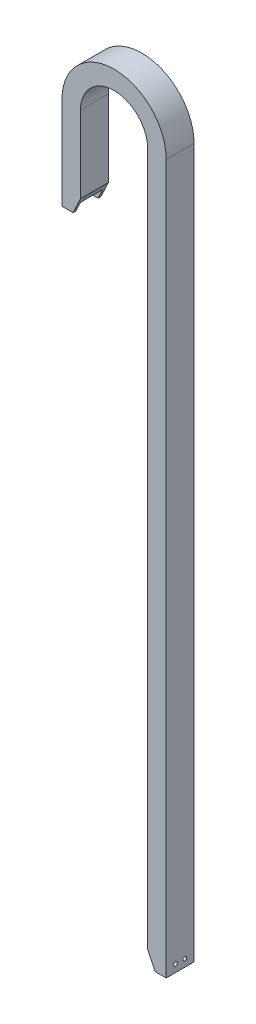
ISO-10303-21;
HEADER;
FILE_DESCRIPTION(('STEP AP214'),'2;1');
FILE_NAME('part.step','',(''),(''),'','','');
FILE_SCHEMA(('AUTOMOTIVE_DESIGN { 1 0 10303 214 1 1 1 1 }'));
ENDSEC;
DATA;
#1=APPLICATION_CONTEXT('core data for automotive mechanical design processes');
#2=APPLICATION_PROTOCOL_DEFINITION('international standard','automotive_design',2000,#1);
#3=PRODUCT_CONTEXT('',#1,'mechanical');
#4=PRODUCT('Part','Part','',(#3));
#5=PRODUCT_RELATED_PRODUCT_CATEGORY('part','',(#4));
#6=PRODUCT_DEFINITION_FORMATION('','',#4);
#7=PRODUCT_DEFINITION_CONTEXT('part definition',#1,'design');
#8=PRODUCT_DEFINITION('design','',#6,#7);
#9=PRODUCT_DEFINITION_SHAPE('','',#8);
#10=(LENGTH_UNIT() NAMED_UNIT(*) SI_UNIT(.MILLI.,.METRE.));
#11=(NAMED_UNIT(*) PLANE_ANGLE_UNIT() SI_UNIT($,.RADIAN.));
#12=(NAMED_UNIT(*) SI_UNIT($,.STERADIAN.) SOLID_ANGLE_UNIT());
#13=UNCERTAINTY_MEASURE_WITH_UNIT(LENGTH_MEASURE(1.E-05),#10,'distance_accuracy_value','');
#14=(GEOMETRIC_REPRESENTATION_CONTEXT(3) GLOBAL_UNCERTAINTY_ASSIGNED_CONTEXT((#13)) GLOBAL_UNIT_ASSIGNED_CONTEXT((#10,
#11,#12)) REPRESENTATION_CONTEXT('',''));
#15=CARTESIAN_POINT('',(0.,0.,0.));
#16=DIRECTION('',(0.,0.,1.));
#17=DIRECTION('',(1.,0.,0.));
#18=AXIS2_PLACEMENT_3D('',#15,#16,#17);
#19=CARTESIAN_POINT('',(0.,0.,15.));
#20=DIRECTION('',(0.,1.,0.));
#21=DIRECTION('',(0.,0.,1.));
#22=AXIS2_PLACEMENT_3D('',#19,#20,#21);
#23=PLANE('',#22);
#24=DIRECTION('',(1.,0.,0.));
#25=VECTOR('',#24,1.);
#26=CARTESIAN_POINT('',(0.,0.,-15.));
#27=LINE('',#26,#25);
#28=CARTESIAN_POINT('',(0.,0.,-15.));
#29=VERTEX_POINT('',#28);
#30=CARTESIAN_POINT('',(12.,0.,-15.));
#31=VERTEX_POINT('',#30);
#32=EDGE_CURVE('E245',#29,#31,#27,.T.);
#33=ORIENTED_EDGE('',*,*,#32,.T.);
#34=DIRECTION('',(0.,0.,1.));
#35=VECTOR('',#34,1.);
#36=CARTESIAN_POINT('',(12.,0.,-15.));
#37=LINE('',#36,#35);
#38=CARTESIAN_POINT('',(12.,0.,-12.));
#39=VERTEX_POINT('',#38);
#40=EDGE_CURVE('E332',#31,#39,#37,.T.);
#41=ORIENTED_EDGE('',*,*,#40,.T.);
#42=DIRECTION('',(1.,0.,0.));
#43=VECTOR('',#42,1.);
#44=CARTESIAN_POINT('',(56.25,0.,-12.));
#45=LINE('',#44,#43);
#46=CARTESIAN_POINT('',(3.,0.,-12.));
#47=VERTEX_POINT('',#46);
#48=EDGE_CURVE('E227',#47,#39,#45,.T.);
#49=ORIENTED_EDGE('',*,*,#48,.F.);
#50=DIRECTION('',(0.,0.,-1.));
#51=VECTOR('',#50,1.);
#52=CARTESIAN_POINT('',(3.,0.,15.));
#53=LINE('',#52,#51);
#54=CARTESIAN_POINT('',(3.,0.,12.));
#55=VERTEX_POINT('',#54);
#56=EDGE_CURVE('E267',#55,#47,#53,.T.);
#57=ORIENTED_EDGE('',*,*,#56,.F.);
#58=DIRECTION('',(1.,0.,0.));
#59=VECTOR('',#58,1.);
#60=CARTESIAN_POINT('',(56.25,0.,12.));
#61=LINE('',#60,#59);
#62=CARTESIAN_POINT('',(12.,0.,12.));
#63=VERTEX_POINT('',#62);
#64=EDGE_CURVE('E249',#55,#63,#61,.T.);
#65=ORIENTED_EDGE('',*,*,#64,.T.);
#66=CARTESIAN_POINT('',(12.,0.,15.));
#67=VERTEX_POINT('',#66);
#68=EDGE_CURVE('E379',#63,#67,#37,.T.);
#69=ORIENTED_EDGE('',*,*,#68,.T.);
#70=DIRECTION('',(1.,0.,0.));
#71=VECTOR('',#70,1.);
#72=CARTESIAN_POINT('',(0.,0.,15.));
#73=LINE('',#72,#71);
#74=CARTESIAN_POINT('',(0.,0.,15.));
#75=VERTEX_POINT('',#74);
#76=EDGE_CURVE('E201',#75,#67,#73,.T.);
#77=ORIENTED_EDGE('',*,*,#76,.F.);
#78=DIRECTION('',(0.,0.,-1.));
#79=VECTOR('',#78,1.);
#80=CARTESIAN_POINT('',(0.,0.,15.));
#81=LINE('',#80,#79);
#82=EDGE_CURVE('E202',#75,#29,#81,.T.);
#83=ORIENTED_EDGE('',*,*,#82,.T.);
#84=EDGE_LOOP('',(#33,#41,#49,#57,#65,#69,#77,#83));
#85=FACE_BOUND('',#84,.T.);
#86=ADVANCED_FACE('F32',(#85),#23,.F.);
#87=CARTESIAN_POINT('',(92.5000000000001,-665.,15.));
#88=DIRECTION('',(0.,1.,0.));
#89=DIRECTION('',(0.,0.,1.));
#90=AXIS2_PLACEMENT_3D('',#87,#88,#89);
#91=PLANE('',#90);
#92=DIRECTION('',(1.,0.,0.));
#93=VECTOR('',#92,1.);
#94=CARTESIAN_POINT('',(92.5000000000001,-665.,15.));
#95=LINE('',#94,#93);
#96=CARTESIAN_POINT('',(100.5,-665.,15.));
#97=VERTEX_POINT('',#96);
#98=CARTESIAN_POINT('',(112.5,-665.,15.));
#99=VERTEX_POINT('',#98);
#100=EDGE_CURVE('E296',#97,#99,#95,.T.);
#101=ORIENTED_EDGE('',*,*,#100,.F.);
#102=DIRECTION('',(0.,0.,1.));
#103=VECTOR('',#102,1.);
#104=CARTESIAN_POINT('',(100.5,-665.,-15.));
#105=LINE('',#104,#103);
#106=CARTESIAN_POINT('',(100.5,-665.,12.));
#107=VERTEX_POINT('',#106);
#108=EDGE_CURVE('E173',#107,#97,#105,.T.);
#109=ORIENTED_EDGE('',*,*,#108,.F.);
#110=DIRECTION('',(1.,0.,0.));
#111=VECTOR('',#110,1.);
#112=CARTESIAN_POINT('',(56.25,-665.,12.));
#113=LINE('',#112,#111);
#114=CARTESIAN_POINT('',(109.5,-665.,12.));
#115=VERTEX_POINT('',#114);
#116=EDGE_CURVE('E259',#107,#115,#113,.T.);
#117=ORIENTED_EDGE('',*,*,#116,.T.);
#118=DIRECTION('',(0.,0.,-1.));
#119=VECTOR('',#118,1.);
#120=CARTESIAN_POINT('',(109.5,-665.,15.));
#121=LINE('',#120,#119);
#122=CARTESIAN_POINT('',(109.5,-665.,-12.));
#123=VERTEX_POINT('',#122);
#124=EDGE_CURVE('E253',#115,#123,#121,.T.);
#125=ORIENTED_EDGE('',*,*,#124,.T.);
#126=DIRECTION('',(1.,0.,0.));
#127=VECTOR('',#126,1.);
#128=CARTESIAN_POINT('',(56.25,-665.,-12.));
#129=LINE('',#128,#127);
#130=CARTESIAN_POINT('',(100.5,-665.,-12.));
#131=VERTEX_POINT('',#130);
#132=EDGE_CURVE('E184',#131,#123,#129,.T.);
#133=ORIENTED_EDGE('',*,*,#132,.F.);
#134=CARTESIAN_POINT('',(100.5,-665.,-15.));
#135=VERTEX_POINT('',#134);
#136=EDGE_CURVE('E46',#135,#131,#105,.T.);
#137=ORIENTED_EDGE('',*,*,#136,.F.);
#138=DIRECTION('',(1.,0.,0.));
#139=VECTOR('',#138,1.);
#140=CARTESIAN_POINT('',(92.5000000000001,-665.,-15.));
#141=LINE('',#140,#139);
#142=CARTESIAN_POINT('',(112.5,-665.,-15.));
#143=VERTEX_POINT('',#142);
#144=EDGE_CURVE('E181',#135,#143,#141,.T.);
#145=ORIENTED_EDGE('',*,*,#144,.T.);
#146=DIRECTION('',(0.,0.,-1.));
#147=VECTOR('',#146,1.);
#148=CARTESIAN_POINT('',(112.5,-665.,15.));
#149=LINE('',#148,#147);
#150=EDGE_CURVE('E212',#99,#143,#149,.T.);
#151=ORIENTED_EDGE('',*,*,#150,.F.);
#152=EDGE_LOOP('',(#101,#109,#117,#125,#133,#137,#145,#151));
#153=FACE_BOUND('',#152,.T.);
#154=ADVANCED_FACE('F179',(#153),#91,.F.);
#155=CARTESIAN_POINT('',(20.,0.,15.));
#156=DIRECTION('',(-1.,0.,0.));
#157=DIRECTION('',(0.,0.,1.));
#158=AXIS2_PLACEMENT_3D('',#155,#156,#157);
#159=PLANE('',#158);
#160=DIRECTION('',(0.,1.,0.));
#161=VECTOR('',#160,1.);
#162=CARTESIAN_POINT('',(20.,0.,15.));
#163=LINE('',#162,#161);
#164=CARTESIAN_POINT('',(20.,17.,15.));
#165=VERTEX_POINT('',#164);
#166=CARTESIAN_POINT('',(20.,100.,15.));
#167=VERTEX_POINT('',#166);
#168=EDGE_CURVE('E289',#165,#167,#163,.T.);
#169=ORIENTED_EDGE('',*,*,#168,.F.);
#170=DIRECTION('',(0.,0.,1.));
#171=VECTOR('',#170,1.);
#172=CARTESIAN_POINT('',(20.,17.,-15.));
#173=LINE('',#172,#171);
#174=CARTESIAN_POINT('',(20.,17.,-15.));
#175=VERTEX_POINT('',#174);
#176=EDGE_CURVE('E325',#175,#165,#173,.T.);
#177=ORIENTED_EDGE('',*,*,#176,.F.);
#178=DIRECTION('',(0.,1.,0.));
#179=VECTOR('',#178,1.);
#180=CARTESIAN_POINT('',(20.,0.,-15.));
#181=LINE('',#180,#179);
#182=CARTESIAN_POINT('',(20.,100.,-15.));
#183=VERTEX_POINT('',#182);
#184=EDGE_CURVE('E305',#175,#183,#181,.T.);
#185=ORIENTED_EDGE('',*,*,#184,.T.);
#186=DIRECTION('',(0.,0.,-1.));
#187=VECTOR('',#186,1.);
#188=CARTESIAN_POINT('',(20.,100.,15.));
#189=LINE('',#188,#187);
#190=EDGE_CURVE('E217',#167,#183,#189,.T.);
#191=ORIENTED_EDGE('',*,*,#190,.F.);
#192=EDGE_LOOP('',(#169,#177,#185,#191));
#193=FACE_BOUND('',#192,.T.);
#194=ADVANCED_FACE('F324',(#193),#159,.F.);
#195=CARTESIAN_POINT('',(56.25,100.,15.));
#196=DIRECTION('',(0.,0.,-1.));
#197=DIRECTION('',(-1.,0.,0.));
#198=AXIS2_PLACEMENT_3D('',#195,#196,#197);
#199=CYLINDRICAL_SURFACE('',#198,36.25);
#200=CARTESIAN_POINT('',(56.25,100.,-15.));
#201=DIRECTION('',(0.,0.,-1.));
#202=DIRECTION('',(-1.,0.,0.));
#203=AXIS2_PLACEMENT_3D('',#200,#201,#202);
#204=CIRCLE('',#203,36.25);
#205=CARTESIAN_POINT('',(92.5,100.,-15.));
#206=VERTEX_POINT('',#205);
#207=EDGE_CURVE('E194',#183,#206,#204,.T.);
#208=ORIENTED_EDGE('',*,*,#207,.T.);
#209=DIRECTION('',(0.,0.,-1.));
#210=VECTOR('',#209,1.);
#211=CARTESIAN_POINT('',(92.5,100.,15.));
#212=LINE('',#211,#210);
#213=CARTESIAN_POINT('',(92.5,100.,15.));
#214=VERTEX_POINT('',#213);
#215=EDGE_CURVE('E214',#214,#206,#212,.T.);
#216=ORIENTED_EDGE('',*,*,#215,.F.);
#217=CARTESIAN_POINT('',(56.25,100.,15.));
#218=DIRECTION('',(0.,0.,-1.));
#219=DIRECTION('',(-1.,0.,0.));
#220=AXIS2_PLACEMENT_3D('',#217,#218,#219);
#221=CIRCLE('',#220,36.25);
#222=EDGE_CURVE('E291',#167,#214,#221,.T.);
#223=ORIENTED_EDGE('',*,*,#222,.F.);
#224=ORIENTED_EDGE('',*,*,#190,.T.);
#225=EDGE_LOOP('',(#208,#216,#223,#224));
#226=FACE_BOUND('',#225,.T.);
#227=ADVANCED_FACE('F309',(#226),#199,.F.);
#228=CARTESIAN_POINT('',(92.5,100.,15.));
#229=DIRECTION('',(1.,0.,0.));
#230=DIRECTION('',(0.,1.,0.));
#231=AXIS2_PLACEMENT_3D('',#228,#229,#230);
#232=PLANE('',#231);
#233=DIRECTION('',(0.,-1.,0.));
#234=VECTOR('',#233,1.);
#235=CARTESIAN_POINT('',(92.5,100.,-15.));
#236=LINE('',#235,#234);
#237=CARTESIAN_POINT('',(92.5,-648.,-15.));
#238=VERTEX_POINT('',#237);
#239=EDGE_CURVE('E190',#206,#238,#236,.T.);
#240=ORIENTED_EDGE('',*,*,#239,.T.);
#241=DIRECTION('',(0.,0.,1.));
#242=VECTOR('',#241,1.);
#243=CARTESIAN_POINT('',(92.5,-648.,-15.));
#244=LINE('',#243,#242);
#245=CARTESIAN_POINT('',(92.5,-648.,15.));
#246=VERTEX_POINT('',#245);
#247=EDGE_CURVE('E168',#238,#246,#244,.T.);
#248=ORIENTED_EDGE('',*,*,#247,.T.);
#249=DIRECTION('',(0.,-1.,0.));
#250=VECTOR('',#249,1.);
#251=CARTESIAN_POINT('',(92.5,100.,15.));
#252=LINE('',#251,#250);
#253=EDGE_CURVE('E293',#214,#246,#252,.T.);
#254=ORIENTED_EDGE('',*,*,#253,.F.);
#255=ORIENTED_EDGE('',*,*,#215,.T.);
#256=EDGE_LOOP('',(#240,#248,#254,#255));
#257=FACE_BOUND('',#256,.T.);
#258=ADVANCED_FACE('F315',(#257),#232,.F.);
#259=CARTESIAN_POINT('',(112.5,100.,15.));
#260=DIRECTION('',(-1.,0.,0.));
#261=DIRECTION('',(0.,-1.,0.));
#262=AXIS2_PLACEMENT_3D('',#259,#260,#261);
#263=PLANE('',#262);
#264=CARTESIAN_POINT('',(112.5,-657.,5.));
#265=DIRECTION('',(-1.,0.,0.));
#266=DIRECTION('',(0.,-1.,0.));
#267=AXIS2_PLACEMENT_3D('',#264,#265,#266);
#268=CIRCLE('',#267,2.10000000000004);
#269=CARTESIAN_POINT('',(112.5,-659.1,5.));
#270=VERTEX_POINT('',#269);
#271=EDGE_CURVE('E608',#270,#270,#268,.T.);
#272=ORIENTED_EDGE('',*,*,#271,.T.);
#273=EDGE_LOOP('',(#272));
#274=FACE_BOUND('',#273,.T.);
#275=CARTESIAN_POINT('',(112.5,-657.,-5.));
#276=DIRECTION('',(-1.,0.,0.));
#277=DIRECTION('',(0.,-1.,0.));
#278=AXIS2_PLACEMENT_3D('',#275,#276,#277);
#279=CIRCLE('',#278,2.10000000000004);
#280=CARTESIAN_POINT('',(112.5,-659.1,-5.));
#281=VERTEX_POINT('',#280);
#282=EDGE_CURVE('E614',#281,#281,#279,.T.);
#283=ORIENTED_EDGE('',*,*,#282,.T.);
#284=EDGE_LOOP('',(#283));
#285=FACE_BOUND('',#284,.T.);
#286=DIRECTION('',(0.,1.,0.));
#287=VECTOR('',#286,1.);
#288=CARTESIAN_POINT('',(112.5,100.,-15.));
#289=LINE('',#288,#287);
#290=CARTESIAN_POINT('',(112.5,100.,-15.));
#291=VERTEX_POINT('',#290);
#292=EDGE_CURVE('E189',#143,#291,#289,.T.);
#293=ORIENTED_EDGE('',*,*,#292,.T.);
#294=DIRECTION('',(0.,0.,-1.));
#295=VECTOR('',#294,1.);
#296=CARTESIAN_POINT('',(112.5,100.,15.));
#297=LINE('',#296,#295);
#298=CARTESIAN_POINT('',(112.5,100.,15.));
#299=VERTEX_POINT('',#298);
#300=EDGE_CURVE('E209',#299,#291,#297,.T.);
#301=ORIENTED_EDGE('',*,*,#300,.F.);
#302=DIRECTION('',(0.,1.,0.));
#303=VECTOR('',#302,1.);
#304=CARTESIAN_POINT('',(112.5,100.,15.));
#305=LINE('',#304,#303);
#306=EDGE_CURVE('E298',#99,#299,#305,.T.);
#307=ORIENTED_EDGE('',*,*,#306,.F.);
#308=ORIENTED_EDGE('',*,*,#150,.T.);
#309=EDGE_LOOP('',(#293,#301,#307,#308));
#310=FACE_BOUND('',#309,.T.);
#311=ADVANCED_FACE('F346',(#274,#285,#310),#263,.F.);
#312=CARTESIAN_POINT('',(56.25,100.,15.));
#313=DIRECTION('',(0.,0.,-1.));
#314=DIRECTION('',(-1.,0.,0.));
#315=AXIS2_PLACEMENT_3D('',#312,#313,#314);
#316=CYLINDRICAL_SURFACE('',#315,56.25);
#317=CARTESIAN_POINT('',(56.25,100.,-15.));
#318=DIRECTION('',(0.,0.,1.));
#319=DIRECTION('',(-1.,0.,0.));
#320=AXIS2_PLACEMENT_3D('',#317,#318,#319);
#321=CIRCLE('',#320,56.25);
#322=CARTESIAN_POINT('',(0.,100.,-15.));
#323=VERTEX_POINT('',#322);
#324=EDGE_CURVE('E192',#291,#323,#321,.T.);
#325=ORIENTED_EDGE('',*,*,#324,.T.);
#326=DIRECTION('',(0.,0.,-1.));
#327=VECTOR('',#326,1.);
#328=CARTESIAN_POINT('',(0.,100.,15.));
#329=LINE('',#328,#327);
#330=CARTESIAN_POINT('',(0.,100.,15.));
#331=VERTEX_POINT('',#330);
#332=EDGE_CURVE('E205',#331,#323,#329,.T.);
#333=ORIENTED_EDGE('',*,*,#332,.F.);
#334=CARTESIAN_POINT('',(56.25,100.,15.));
#335=DIRECTION('',(0.,0.,1.));
#336=DIRECTION('',(-1.,0.,0.));
#337=AXIS2_PLACEMENT_3D('',#334,#335,#336);
#338=CIRCLE('',#337,56.25);
#339=EDGE_CURVE('E300',#299,#331,#338,.T.);
#340=ORIENTED_EDGE('',*,*,#339,.F.);
#341=ORIENTED_EDGE('',*,*,#300,.T.);
#342=EDGE_LOOP('',(#325,#333,#340,#341));
#343=FACE_BOUND('',#342,.T.);
#344=ADVANCED_FACE('F341',(#343),#316,.T.);
#345=CARTESIAN_POINT('',(0.,0.,15.));
#346=DIRECTION('',(1.,0.,0.));
#347=DIRECTION('',(0.,0.,-1.));
#348=AXIS2_PLACEMENT_3D('',#345,#346,#347);
#349=PLANE('',#348);
#350=CARTESIAN_POINT('',(0.,8.,5.));
#351=DIRECTION('',(-1.,0.,0.));
#352=DIRECTION('',(0.,0.,1.));
#353=AXIS2_PLACEMENT_3D('',#350,#351,#352);
#354=CIRCLE('',#353,2.1);
#355=CARTESIAN_POINT('',(0.,8.,7.1));
#356=VERTEX_POINT('',#355);
#357=EDGE_CURVE('E595',#356,#356,#354,.T.);
#358=ORIENTED_EDGE('',*,*,#357,.F.);
#359=EDGE_LOOP('',(#358));
#360=FACE_BOUND('',#359,.T.);
#361=CARTESIAN_POINT('',(0.,8.,-5.));
#362=DIRECTION('',(-1.,0.,0.));
#363=DIRECTION('',(0.,0.,1.));
#364=AXIS2_PLACEMENT_3D('',#361,#362,#363);
#365=CIRCLE('',#364,2.1);
#366=CARTESIAN_POINT('',(0.,8.,-2.9));
#367=VERTEX_POINT('',#366);
#368=EDGE_CURVE('E598',#367,#367,#365,.T.);
#369=ORIENTED_EDGE('',*,*,#368,.F.);
#370=EDGE_LOOP('',(#369));
#371=FACE_BOUND('',#370,.T.);
#372=DIRECTION('',(0.,-1.,0.));
#373=VECTOR('',#372,1.);
#374=CARTESIAN_POINT('',(0.,0.,-15.));
#375=LINE('',#374,#373);
#376=EDGE_CURVE('E199',#323,#29,#375,.T.);
#377=ORIENTED_EDGE('',*,*,#376,.T.);
#378=ORIENTED_EDGE('',*,*,#82,.F.);
#379=DIRECTION('',(0.,-1.,0.));
#380=VECTOR('',#379,1.);
#381=CARTESIAN_POINT('',(0.,0.,15.));
#382=LINE('',#381,#380);
#383=EDGE_CURVE('E206',#331,#75,#382,.T.);
#384=ORIENTED_EDGE('',*,*,#383,.F.);
#385=ORIENTED_EDGE('',*,*,#332,.T.);
#386=EDGE_LOOP('',(#377,#378,#384,#385));
#387=FACE_BOUND('',#386,.T.);
#388=ADVANCED_FACE('F338',(#360,#371,#387),#349,.F.);
#389=CARTESIAN_POINT('',(56.25,100.,15.));
#390=DIRECTION('',(0.,0.,-1.));
#391=DIRECTION('',(-1.,0.,0.));
#392=AXIS2_PLACEMENT_3D('',#389,#390,#391);
#393=PLANE('',#392);
#394=ORIENTED_EDGE('',*,*,#253,.T.);
#395=DIRECTION('',(-0.425797036329885,0.904818702200991,0.));
#396=VECTOR('',#395,1.);
#397=CARTESIAN_POINT('',(92.5,-648.,15.));
#398=LINE('',#397,#396);
#399=EDGE_CURVE('E174',#97,#246,#398,.T.);
#400=ORIENTED_EDGE('',*,*,#399,.F.);
#401=ORIENTED_EDGE('',*,*,#100,.T.);
#402=ORIENTED_EDGE('',*,*,#306,.T.);
#403=ORIENTED_EDGE('',*,*,#339,.T.);
#404=ORIENTED_EDGE('',*,*,#383,.T.);
#405=ORIENTED_EDGE('',*,*,#76,.T.);
#406=DIRECTION('',(-0.42579703632988,-0.904818702200994,0.));
#407=VECTOR('',#406,1.);
#408=CARTESIAN_POINT('',(12.,0.,15.));
#409=LINE('',#408,#407);
#410=EDGE_CURVE('E321',#165,#67,#409,.T.);
#411=ORIENTED_EDGE('',*,*,#410,.F.);
#412=ORIENTED_EDGE('',*,*,#168,.T.);
#413=ORIENTED_EDGE('',*,*,#222,.T.);
#414=EDGE_LOOP('',(#394,#400,#401,#402,#403,#404,#405,#411,#412,#413));
#415=FACE_BOUND('',#414,.T.);
#416=ADVANCED_FACE('F318',(#415),#393,.F.);
#417=CARTESIAN_POINT('',(56.25,100.,-15.));
#418=DIRECTION('',(0.,0.,-1.));
#419=DIRECTION('',(-1.,0.,0.));
#420=AXIS2_PLACEMENT_3D('',#417,#418,#419);
#421=PLANE('',#420);
#422=DIRECTION('',(-0.425797036329885,0.904818702200991,0.));
#423=VECTOR('',#422,1.);
#424=CARTESIAN_POINT('',(92.5,-648.,-15.));
#425=LINE('',#424,#423);
#426=EDGE_CURVE('E165',#135,#238,#425,.T.);
#427=ORIENTED_EDGE('',*,*,#426,.T.);
#428=ORIENTED_EDGE('',*,*,#239,.F.);
#429=ORIENTED_EDGE('',*,*,#207,.F.);
#430=ORIENTED_EDGE('',*,*,#184,.F.);
#431=DIRECTION('',(-0.42579703632988,-0.904818702200994,0.));
#432=VECTOR('',#431,1.);
#433=CARTESIAN_POINT('',(12.,0.,-15.));
#434=LINE('',#433,#432);
#435=EDGE_CURVE('E328',#175,#31,#434,.T.);
#436=ORIENTED_EDGE('',*,*,#435,.T.);
#437=ORIENTED_EDGE('',*,*,#32,.F.);
#438=ORIENTED_EDGE('',*,*,#376,.F.);
#439=ORIENTED_EDGE('',*,*,#324,.F.);
#440=ORIENTED_EDGE('',*,*,#292,.F.);
#441=ORIENTED_EDGE('',*,*,#144,.F.);
#442=EDGE_LOOP('',(#427,#428,#429,#430,#436,#437,#438,#439,#440,#441));
#443=FACE_BOUND('',#442,.T.);
#444=ADVANCED_FACE('F187',(#443),#421,.T.);
#445=CARTESIAN_POINT('',(17.,0.,15.));
#446=DIRECTION('',(-1.,0.,0.));
#447=DIRECTION('',(0.,0.,1.));
#448=AXIS2_PLACEMENT_3D('',#445,#446,#447);
#449=PLANE('',#448);
#450=DIRECTION('',(0.,0.,-1.));
#451=VECTOR('',#450,1.);
#452=CARTESIAN_POINT('',(17.,10.625,15.));
#453=LINE('',#452,#451);
#454=CARTESIAN_POINT('',(17.,10.625,12.));
#455=VERTEX_POINT('',#454);
#456=CARTESIAN_POINT('',(17.,10.625,-12.));
#457=VERTEX_POINT('',#456);
#458=EDGE_CURVE('E53',#455,#457,#453,.T.);
#459=ORIENTED_EDGE('',*,*,#458,.F.);
#460=DIRECTION('',(0.,1.,0.));
#461=VECTOR('',#460,1.);
#462=CARTESIAN_POINT('',(17.,100.,12.));
#463=LINE('',#462,#461);
#464=CARTESIAN_POINT('',(17.,100.,12.));
#465=VERTEX_POINT('',#464);
#466=EDGE_CURVE('E247',#455,#465,#463,.T.);
#467=ORIENTED_EDGE('',*,*,#466,.T.);
#468=DIRECTION('',(0.,0.,-1.));
#469=VECTOR('',#468,1.);
#470=CARTESIAN_POINT('',(17.,100.,15.));
#471=LINE('',#470,#469);
#472=CARTESIAN_POINT('',(17.,100.,-12.));
#473=VERTEX_POINT('',#472);
#474=EDGE_CURVE('E233',#465,#473,#471,.T.);
#475=ORIENTED_EDGE('',*,*,#474,.T.);
#476=DIRECTION('',(0.,1.,0.));
#477=VECTOR('',#476,1.);
#478=CARTESIAN_POINT('',(17.,100.,-12.));
#479=LINE('',#478,#477);
#480=EDGE_CURVE('E224',#457,#473,#479,.T.);
#481=ORIENTED_EDGE('',*,*,#480,.F.);
#482=EDGE_LOOP('',(#459,#467,#475,#481));
#483=FACE_BOUND('',#482,.T.);
#484=ADVANCED_FACE('F230',(#483),#449,.T.);
#485=CARTESIAN_POINT('',(56.25,100.,15.));
#486=DIRECTION('',(0.,0.,-1.));
#487=DIRECTION('',(-1.,0.,0.));
#488=AXIS2_PLACEMENT_3D('',#485,#486,#487);
#489=CYLINDRICAL_SURFACE('',#488,39.25);
#490=CARTESIAN_POINT('',(56.25,100.,-12.));
#491=DIRECTION('',(0.,0.,-1.));
#492=DIRECTION('',(-1.,0.,0.));
#493=AXIS2_PLACEMENT_3D('',#490,#491,#492);
#494=CIRCLE('',#493,39.25);
#495=CARTESIAN_POINT('',(95.5,100.,-12.));
#496=VERTEX_POINT('',#495);
#497=EDGE_CURVE('E235',#473,#496,#494,.T.);
#498=ORIENTED_EDGE('',*,*,#497,.F.);
#499=ORIENTED_EDGE('',*,*,#474,.F.);
#500=CARTESIAN_POINT('',(56.25,100.,12.));
#501=DIRECTION('',(0.,0.,-1.));
#502=DIRECTION('',(-1.,0.,0.));
#503=AXIS2_PLACEMENT_3D('',#500,#501,#502);
#504=CIRCLE('',#503,39.25);
#505=CARTESIAN_POINT('',(95.5,100.,12.));
#506=VERTEX_POINT('',#505);
#507=EDGE_CURVE('E248',#465,#506,#504,.T.);
#508=ORIENTED_EDGE('',*,*,#507,.T.);
#509=DIRECTION('',(0.,0.,1.));
#510=VECTOR('',#509,1.);
#511=CARTESIAN_POINT('',(95.5,100.,15.));
#512=LINE('',#511,#510);
#513=EDGE_CURVE('E246',#506,#496,#512,.F.);
#514=ORIENTED_EDGE('',*,*,#513,.T.);
#515=EDGE_LOOP('',(#498,#499,#508,#514));
#516=FACE_BOUND('',#515,.T.);
#517=ADVANCED_FACE('F459',(#516),#489,.T.);
#518=CARTESIAN_POINT('',(95.5,100.,15.));
#519=DIRECTION('',(1.,0.,0.));
#520=DIRECTION('',(0.,1.,0.));
#521=AXIS2_PLACEMENT_3D('',#518,#519,#520);
#522=PLANE('',#521);
#523=DIRECTION('',(0.,0.,1.));
#524=VECTOR('',#523,1.);
#525=CARTESIAN_POINT('',(95.5000000000001,-654.375,15.));
#526=LINE('',#525,#524);
#527=CARTESIAN_POINT('',(95.5000000000001,-654.375,-12.));
#528=VERTEX_POINT('',#527);
#529=CARTESIAN_POINT('',(95.5000000000001,-654.375,12.));
#530=VERTEX_POINT('',#529);
#531=EDGE_CURVE('E369',#528,#530,#526,.T.);
#532=ORIENTED_EDGE('',*,*,#531,.F.);
#533=DIRECTION('',(0.,-1.,0.));
#534=VECTOR('',#533,1.);
#535=CARTESIAN_POINT('',(95.5,100.,-12.));
#536=LINE('',#535,#534);
#537=EDGE_CURVE('E237',#496,#528,#536,.T.);
#538=ORIENTED_EDGE('',*,*,#537,.F.);
#539=ORIENTED_EDGE('',*,*,#513,.F.);
#540=DIRECTION('',(0.,-1.,0.));
#541=VECTOR('',#540,1.);
#542=CARTESIAN_POINT('',(95.5,100.,12.));
#543=LINE('',#542,#541);
#544=EDGE_CURVE('E255',#506,#530,#543,.T.);
#545=ORIENTED_EDGE('',*,*,#544,.T.);
#546=EDGE_LOOP('',(#532,#538,#539,#545));
#547=FACE_BOUND('',#546,.T.);
#548=ADVANCED_FACE('F371',(#547),#522,.T.);
#549=CARTESIAN_POINT('',(109.5,100.,15.));
#550=DIRECTION('',(-1.,0.,0.));
#551=DIRECTION('',(0.,-1.,0.));
#552=AXIS2_PLACEMENT_3D('',#549,#550,#551);
#553=PLANE('',#552);
#554=CARTESIAN_POINT('',(109.5,-657.,5.));
#555=DIRECTION('',(-1.,0.,0.));
#556=DIRECTION('',(0.,-1.,0.));
#557=AXIS2_PLACEMENT_3D('',#554,#555,#556);
#558=CIRCLE('',#557,2.10000000000004);
#559=CARTESIAN_POINT('',(109.5,-659.1,5.));
#560=VERTEX_POINT('',#559);
#561=EDGE_CURVE('E607',#560,#560,#558,.T.);
#562=ORIENTED_EDGE('',*,*,#561,.F.);
#563=EDGE_LOOP('',(#562));
#564=FACE_BOUND('',#563,.T.);
#565=CARTESIAN_POINT('',(109.5,-657.,-5.));
#566=DIRECTION('',(-1.,0.,0.));
#567=DIRECTION('',(0.,-1.,0.));
#568=AXIS2_PLACEMENT_3D('',#565,#566,#567);
#569=CIRCLE('',#568,2.10000000000004);
#570=CARTESIAN_POINT('',(109.5,-659.1,-5.));
#571=VERTEX_POINT('',#570);
#572=EDGE_CURVE('E611',#571,#571,#569,.T.);
#573=ORIENTED_EDGE('',*,*,#572,.F.);
#574=EDGE_LOOP('',(#573));
#575=FACE_BOUND('',#574,.T.);
#576=DIRECTION('',(0.,1.,0.));
#577=VECTOR('',#576,1.);
#578=CARTESIAN_POINT('',(109.5,100.,-12.));
#579=LINE('',#578,#577);
#580=CARTESIAN_POINT('',(109.5,100.,-12.));
#581=VERTEX_POINT('',#580);
#582=EDGE_CURVE('E268',#123,#581,#579,.T.);
#583=ORIENTED_EDGE('',*,*,#582,.F.);
#584=ORIENTED_EDGE('',*,*,#124,.F.);
#585=DIRECTION('',(0.,1.,0.));
#586=VECTOR('',#585,1.);
#587=CARTESIAN_POINT('',(109.5,100.,12.));
#588=LINE('',#587,#586);
#589=CARTESIAN_POINT('',(109.5,100.,12.));
#590=VERTEX_POINT('',#589);
#591=EDGE_CURVE('E260',#115,#590,#588,.T.);
#592=ORIENTED_EDGE('',*,*,#591,.T.);
#593=DIRECTION('',(0.,0.,-1.));
#594=VECTOR('',#593,1.);
#595=CARTESIAN_POINT('',(109.5,100.,15.));
#596=LINE('',#595,#594);
#597=EDGE_CURVE('E271',#590,#581,#596,.T.);
#598=ORIENTED_EDGE('',*,*,#597,.T.);
#599=EDGE_LOOP('',(#583,#584,#592,#598));
#600=FACE_BOUND('',#599,.T.);
#601=ADVANCED_FACE('F361',(#564,#575,#600),#553,.T.);
#602=CARTESIAN_POINT('',(56.25,100.,15.));
#603=DIRECTION('',(0.,0.,-1.));
#604=DIRECTION('',(-1.,0.,0.));
#605=AXIS2_PLACEMENT_3D('',#602,#603,#604);
#606=CYLINDRICAL_SURFACE('',#605,53.25);
#607=CARTESIAN_POINT('',(56.25,100.,-12.));
#608=DIRECTION('',(0.,0.,-1.));
#609=DIRECTION('',(-1.,0.,0.));
#610=AXIS2_PLACEMENT_3D('',#607,#608,#609);
#611=CIRCLE('',#610,53.25);
#612=CARTESIAN_POINT('',(3.,100.,-12.));
#613=VERTEX_POINT('',#612);
#614=EDGE_CURVE('E270',#581,#613,#611,.F.);
#615=ORIENTED_EDGE('',*,*,#614,.F.);
#616=ORIENTED_EDGE('',*,*,#597,.F.);
#617=CARTESIAN_POINT('',(56.25,100.,12.));
#618=DIRECTION('',(0.,0.,-1.));
#619=DIRECTION('',(-1.,0.,0.));
#620=AXIS2_PLACEMENT_3D('',#617,#618,#619);
#621=CIRCLE('',#620,53.25);
#622=CARTESIAN_POINT('',(3.,100.,12.));
#623=VERTEX_POINT('',#622);
#624=EDGE_CURVE('E262',#590,#623,#621,.F.);
#625=ORIENTED_EDGE('',*,*,#624,.T.);
#626=DIRECTION('',(0.,0.,-1.));
#627=VECTOR('',#626,1.);
#628=CARTESIAN_POINT('',(3.,100.,15.));
#629=LINE('',#628,#627);
#630=EDGE_CURVE('E274',#623,#613,#629,.T.);
#631=ORIENTED_EDGE('',*,*,#630,.T.);
#632=EDGE_LOOP('',(#615,#616,#625,#631));
#633=FACE_BOUND('',#632,.T.);
#634=ADVANCED_FACE('F364',(#633),#606,.F.);
#635=CARTESIAN_POINT('',(3.,0.,15.));
#636=DIRECTION('',(1.,0.,0.));
#637=DIRECTION('',(0.,0.,-1.));
#638=AXIS2_PLACEMENT_3D('',#635,#636,#637);
#639=PLANE('',#638);
#640=CARTESIAN_POINT('',(3.,8.,5.));
#641=DIRECTION('',(1.,0.,0.));
#642=DIRECTION('',(0.,0.,-1.));
#643=AXIS2_PLACEMENT_3D('',#640,#641,#642);
#644=CIRCLE('',#643,2.1);
#645=CARTESIAN_POINT('',(3.,8.,2.9));
#646=VERTEX_POINT('',#645);
#647=EDGE_CURVE('E597',#646,#646,#644,.F.);
#648=ORIENTED_EDGE('',*,*,#647,.T.);
#649=EDGE_LOOP('',(#648));
#650=FACE_BOUND('',#649,.T.);
#651=CARTESIAN_POINT('',(3.,8.,-5.));
#652=DIRECTION('',(1.,0.,0.));
#653=DIRECTION('',(0.,0.,-1.));
#654=AXIS2_PLACEMENT_3D('',#651,#652,#653);
#655=CIRCLE('',#654,2.1);
#656=CARTESIAN_POINT('',(3.,8.,-7.1));
#657=VERTEX_POINT('',#656);
#658=EDGE_CURVE('E601',#657,#657,#655,.F.);
#659=ORIENTED_EDGE('',*,*,#658,.T.);
#660=EDGE_LOOP('',(#659));
#661=FACE_BOUND('',#660,.T.);
#662=DIRECTION('',(0.,-1.,0.));
#663=VECTOR('',#662,1.);
#664=CARTESIAN_POINT('',(3.,100.,-12.));
#665=LINE('',#664,#663);
#666=EDGE_CURVE('E276',#613,#47,#665,.T.);
#667=ORIENTED_EDGE('',*,*,#666,.F.);
#668=ORIENTED_EDGE('',*,*,#630,.F.);
#669=DIRECTION('',(0.,-1.,0.));
#670=VECTOR('',#669,1.);
#671=CARTESIAN_POINT('',(3.,100.,12.));
#672=LINE('',#671,#670);
#673=EDGE_CURVE('E264',#623,#55,#672,.T.);
#674=ORIENTED_EDGE('',*,*,#673,.T.);
#675=ORIENTED_EDGE('',*,*,#56,.T.);
#676=EDGE_LOOP('',(#667,#668,#674,#675));
#677=FACE_BOUND('',#676,.T.);
#678=ADVANCED_FACE('F385',(#650,#661,#677),#639,.T.);
#679=CARTESIAN_POINT('',(56.25,100.,12.));
#680=DIRECTION('',(0.,0.,-1.));
#681=DIRECTION('',(-1.,0.,0.));
#682=AXIS2_PLACEMENT_3D('',#679,#680,#681);
#683=PLANE('',#682);
#684=DIRECTION('',(0.425797036329885,-0.904818702200991,0.));
#685=VECTOR('',#684,1.);
#686=CARTESIAN_POINT('',(-202.25354107649,-21.648725212468,12.));
#687=LINE('',#686,#685);
#688=EDGE_CURVE('E355',#530,#107,#687,.T.);
#689=ORIENTED_EDGE('',*,*,#688,.F.);
#690=ORIENTED_EDGE('',*,*,#544,.F.);
#691=ORIENTED_EDGE('',*,*,#507,.F.);
#692=ORIENTED_EDGE('',*,*,#466,.F.);
#693=DIRECTION('',(0.42579703632988,0.904818702200994,0.));
#694=VECTOR('',#693,1.);
#695=CARTESIAN_POINT('',(58.5495750708216,98.9178470254957,12.));
#696=LINE('',#695,#694);
#697=EDGE_CURVE('E239',#63,#455,#696,.T.);
#698=ORIENTED_EDGE('',*,*,#697,.F.);
#699=ORIENTED_EDGE('',*,*,#64,.F.);
#700=ORIENTED_EDGE('',*,*,#673,.F.);
#701=ORIENTED_EDGE('',*,*,#624,.F.);
#702=ORIENTED_EDGE('',*,*,#591,.F.);
#703=ORIENTED_EDGE('',*,*,#116,.F.);
#704=EDGE_LOOP('',(#689,#690,#691,#692,#698,#699,#700,#701,#702,#703));
#705=FACE_BOUND('',#704,.T.);
#706=ADVANCED_FACE('F353',(#705),#683,.T.);
#707=CARTESIAN_POINT('',(56.25,100.,-12.));
#708=DIRECTION('',(0.,0.,-1.));
#709=DIRECTION('',(-1.,0.,0.));
#710=AXIS2_PLACEMENT_3D('',#707,#708,#709);
#711=PLANE('',#710);
#712=ORIENTED_EDGE('',*,*,#537,.T.);
#713=DIRECTION('',(0.425797036329885,-0.904818702200991,0.));
#714=VECTOR('',#713,1.);
#715=CARTESIAN_POINT('',(-202.25354107649,-21.648725212468,-12.));
#716=LINE('',#715,#714);
#717=EDGE_CURVE('E11',#528,#131,#716,.T.);
#718=ORIENTED_EDGE('',*,*,#717,.T.);
#719=ORIENTED_EDGE('',*,*,#132,.T.);
#720=ORIENTED_EDGE('',*,*,#582,.T.);
#721=ORIENTED_EDGE('',*,*,#614,.T.);
#722=ORIENTED_EDGE('',*,*,#666,.T.);
#723=ORIENTED_EDGE('',*,*,#48,.T.);
#724=DIRECTION('',(0.42579703632988,0.904818702200994,0.));
#725=VECTOR('',#724,1.);
#726=CARTESIAN_POINT('',(58.5495750708216,98.9178470254957,-12.));
#727=LINE('',#726,#725);
#728=EDGE_CURVE('E39',#39,#457,#727,.T.);
#729=ORIENTED_EDGE('',*,*,#728,.T.);
#730=ORIENTED_EDGE('',*,*,#480,.T.);
#731=ORIENTED_EDGE('',*,*,#497,.T.);
#732=EDGE_LOOP('',(#712,#718,#719,#720,#721,#722,#723,#729,#730,#731));
#733=FACE_BOUND('',#732,.T.);
#734=ADVANCED_FACE('F223',(#733),#711,.F.);
#735=CARTESIAN_POINT('',(12.,0.,-15.));
#736=DIRECTION('',(-0.904818702200994,0.42579703632988,0.));
#737=DIRECTION('',(-0.42579703632988,-0.904818702200994,0.));
#738=AXIS2_PLACEMENT_3D('',#735,#736,#737);
#739=PLANE('',#738);
#740=ORIENTED_EDGE('',*,*,#697,.T.);
#741=ORIENTED_EDGE('',*,*,#458,.T.);
#742=ORIENTED_EDGE('',*,*,#728,.F.);
#743=ORIENTED_EDGE('',*,*,#40,.F.);
#744=ORIENTED_EDGE('',*,*,#435,.F.);
#745=ORIENTED_EDGE('',*,*,#176,.T.);
#746=ORIENTED_EDGE('',*,*,#410,.T.);
#747=ORIENTED_EDGE('',*,*,#68,.F.);
#748=EDGE_LOOP('',(#740,#741,#742,#743,#744,#745,#746,#747));
#749=FACE_BOUND('',#748,.T.);
#750=ADVANCED_FACE('F381',(#749),#739,.F.);
#751=CARTESIAN_POINT('',(92.5,-648.,-15.));
#752=DIRECTION('',(0.904818702200991,0.425797036329885,0.));
#753=DIRECTION('',(-0.425797036329885,0.904818702200991,0.));
#754=AXIS2_PLACEMENT_3D('',#751,#752,#753);
#755=PLANE('',#754);
#756=ORIENTED_EDGE('',*,*,#688,.T.);
#757=ORIENTED_EDGE('',*,*,#108,.T.);
#758=ORIENTED_EDGE('',*,*,#399,.T.);
#759=ORIENTED_EDGE('',*,*,#247,.F.);
#760=ORIENTED_EDGE('',*,*,#426,.F.);
#761=ORIENTED_EDGE('',*,*,#136,.T.);
#762=ORIENTED_EDGE('',*,*,#717,.F.);
#763=ORIENTED_EDGE('',*,*,#531,.T.);
#764=EDGE_LOOP('',(#756,#757,#758,#759,#760,#761,#762,#763));
#765=FACE_BOUND('',#764,.T.);
#766=ADVANCED_FACE('F166',(#765),#755,.F.);
#767=CARTESIAN_POINT('',(112.5,-657.,-5.));
#768=DIRECTION('',(-1.,0.,0.));
#769=DIRECTION('',(0.,-1.,0.));
#770=AXIS2_PLACEMENT_3D('',#767,#768,#769);
#771=CYLINDRICAL_SURFACE('',#770,2.10000000000004);
#772=ORIENTED_EDGE('',*,*,#282,.F.);
#773=EDGE_LOOP('',(#772));
#774=FACE_BOUND('',#773,.T.);
#775=ORIENTED_EDGE('',*,*,#572,.T.);
#776=EDGE_LOOP('',(#775));
#777=FACE_BOUND('',#776,.T.);
#778=ADVANCED_FACE('F550',(#774,#777),#771,.F.);
#779=CARTESIAN_POINT('',(112.5,-657.,5.));
#780=DIRECTION('',(-1.,0.,0.));
#781=DIRECTION('',(0.,-1.,0.));
#782=AXIS2_PLACEMENT_3D('',#779,#780,#781);
#783=CYLINDRICAL_SURFACE('',#782,2.10000000000004);
#784=ORIENTED_EDGE('',*,*,#271,.F.);
#785=EDGE_LOOP('',(#784));
#786=FACE_BOUND('',#785,.T.);
#787=ORIENTED_EDGE('',*,*,#561,.T.);
#788=EDGE_LOOP('',(#787));
#789=FACE_BOUND('',#788,.T.);
#790=ADVANCED_FACE('F557',(#786,#789),#783,.F.);
#791=CARTESIAN_POINT('',(8.939696961967,8.,-5.));
#792=DIRECTION('',(-1.,0.,0.));
#793=DIRECTION('',(0.,0.,1.));
#794=AXIS2_PLACEMENT_3D('',#791,#792,#793);
#795=CYLINDRICAL_SURFACE('',#794,2.1);
#796=ORIENTED_EDGE('',*,*,#368,.T.);
#797=EDGE_LOOP('',(#796));
#798=FACE_BOUND('',#797,.T.);
#799=ORIENTED_EDGE('',*,*,#658,.F.);
#800=EDGE_LOOP('',(#799));
#801=FACE_BOUND('',#800,.T.);
#802=ADVANCED_FACE('F565',(#798,#801),#795,.F.);
#803=CARTESIAN_POINT('',(8.939696961967,8.,5.));
#804=DIRECTION('',(-1.,0.,0.));
#805=DIRECTION('',(0.,0.,1.));
#806=AXIS2_PLACEMENT_3D('',#803,#804,#805);
#807=CYLINDRICAL_SURFACE('',#806,2.1);
#808=ORIENTED_EDGE('',*,*,#357,.T.);
#809=EDGE_LOOP('',(#808));
#810=FACE_BOUND('',#809,.T.);
#811=ORIENTED_EDGE('',*,*,#647,.F.);
#812=EDGE_LOOP('',(#811));
#813=FACE_BOUND('',#812,.T.);
#814=ADVANCED_FACE('F573',(#810,#813),#807,.F.);
#815=CLOSED_SHELL('',(#86,#154,#194,#227,#258,#311,#344,#388,#416,#444,#484,#517,#548,#601,#634,
#678,#706,#734,#750,#766,#778,#790,#802,#814));
#816=MANIFOLD_SOLID_BREP('B2',#815);
#817=ADVANCED_BREP_SHAPE_REPRESENTATION('',(#18,#816),#14);
#818=SHAPE_DEFINITION_REPRESENTATION(#9,#817);
ENDSEC;
END-ISO-10303-21;
